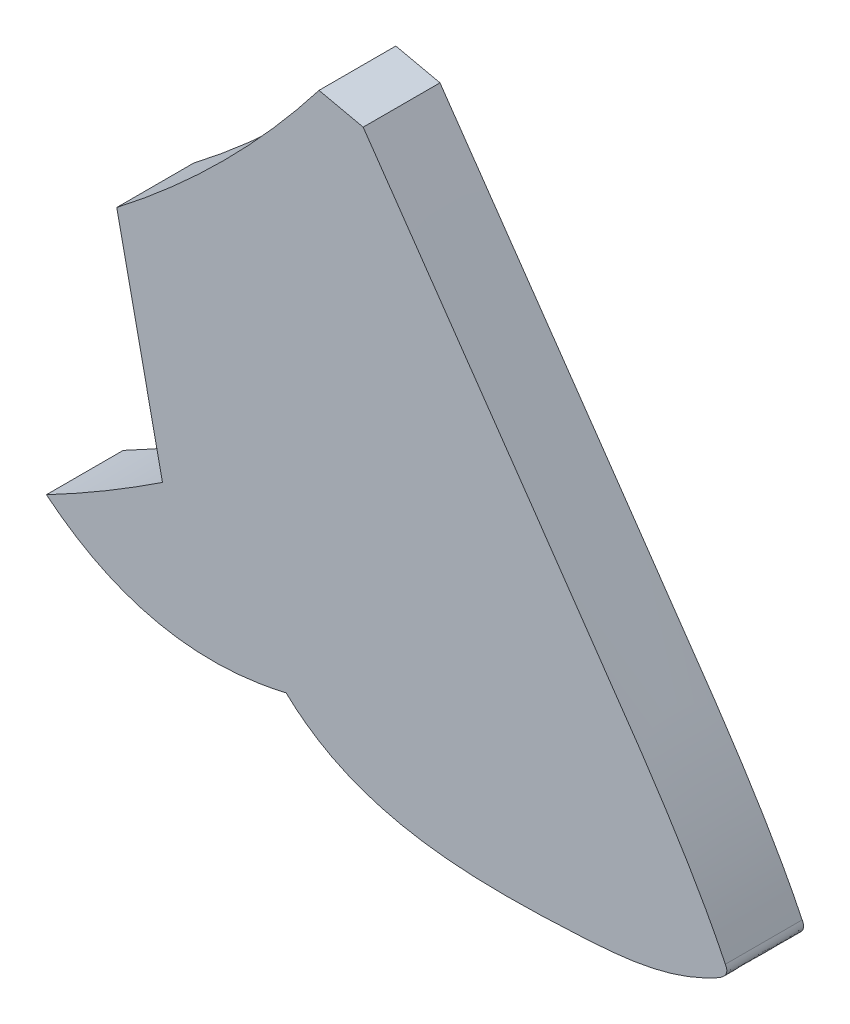
ISO-10303-21;
HEADER;
FILE_DESCRIPTION(('STEP AP214'),'2;1');
FILE_NAME('part.step','',(''),(''),'','','');
FILE_SCHEMA(('AUTOMOTIVE_DESIGN { 1 0 10303 214 1 1 1 1 }'));
ENDSEC;
DATA;
#1=APPLICATION_CONTEXT('core data for automotive mechanical design processes');
#2=APPLICATION_PROTOCOL_DEFINITION('international standard','automotive_design',2000,#1);
#3=PRODUCT_CONTEXT('',#1,'mechanical');
#4=PRODUCT('Part','Part','',(#3));
#5=PRODUCT_RELATED_PRODUCT_CATEGORY('part','',(#4));
#6=PRODUCT_DEFINITION_FORMATION('','',#4);
#7=PRODUCT_DEFINITION_CONTEXT('part definition',#1,'design');
#8=PRODUCT_DEFINITION('design','',#6,#7);
#9=PRODUCT_DEFINITION_SHAPE('','',#8);
#10=(LENGTH_UNIT() NAMED_UNIT(*) SI_UNIT(.MILLI.,.METRE.));
#11=(NAMED_UNIT(*) PLANE_ANGLE_UNIT() SI_UNIT($,.RADIAN.));
#12=(NAMED_UNIT(*) SI_UNIT($,.STERADIAN.) SOLID_ANGLE_UNIT());
#13=UNCERTAINTY_MEASURE_WITH_UNIT(LENGTH_MEASURE(1.E-05),#10,'distance_accuracy_value','');
#14=(GEOMETRIC_REPRESENTATION_CONTEXT(3) GLOBAL_UNCERTAINTY_ASSIGNED_CONTEXT((#13)) GLOBAL_UNIT_ASSIGNED_CONTEXT((#10,
#11,#12)) REPRESENTATION_CONTEXT('',''));
#15=CARTESIAN_POINT('',(0.,0.,0.));
#16=DIRECTION('',(0.,0.,1.));
#17=DIRECTION('',(1.,0.,0.));
#18=AXIS2_PLACEMENT_3D('',#15,#16,#17);
#19=CARTESIAN_POINT('',(0.,0.,0.));
#20=DIRECTION('',(0.,0.,1.));
#21=DIRECTION('',(1.,0.,0.));
#22=AXIS2_PLACEMENT_3D('',#19,#20,#21);
#23=PLANE('',#22);
#24=CARTESIAN_POINT('',(50.5136545200715,-48.3160755048055,0.));
#25=CARTESIAN_POINT('',(50.7011172379913,-48.6454402318248,0.));
#26=CARTESIAN_POINT('',(48.5240591666521,-49.9538392605319,0.));
#27=CARTESIAN_POINT('',(42.5275572551689,-50.418084569808,0.));
#28=CARTESIAN_POINT('',(36.182871361729,-50.418084569808,0.));
#29=CARTESIAN_POINT('',(33.3528454459016,-47.7136778830354,0.));
#30=B_SPLINE_CURVE_WITH_KNOTS('',3,(#24,#25,#26,#27,#28,#29),.UNSPECIFIED.,.F.,.F.,(4,1,1,4),
(0.,0.0484291937989246,0.338693976673703,1.),.UNSPECIFIED.);
#31=CARTESIAN_POINT('',(50.5136545200715,-48.3160755048055,0.));
#32=VERTEX_POINT('',#31);
#33=CARTESIAN_POINT('',(33.3528454459016,-47.7136778830354,0.));
#34=VERTEX_POINT('',#33);
#35=EDGE_CURVE('E119',#32,#34,#30,.T.);
#36=ORIENTED_EDGE('',*,*,#35,.T.);
#37=CARTESIAN_POINT('',(23.9856963450974,-45.6917300262926,0.));
#38=CARTESIAN_POINT('',(28.0044893849599,-48.9849538612235,0.));
#39=CARTESIAN_POINT('',(33.3528454459016,-47.7136778830354,0.));
#40=B_SPLINE_CURVE_WITH_KNOTS('',2,(#37,#38,#39),.UNSPECIFIED.,.F.,.F.,(3,3),(0.,1.),.UNSPECIFIED.);
#41=CARTESIAN_POINT('',(23.9856963450974,-45.6917300262927,0.));
#42=VERTEX_POINT('',#41);
#43=EDGE_CURVE('E59',#42,#34,#40,.T.);
#44=ORIENTED_EDGE('',*,*,#43,.F.);
#45=CARTESIAN_POINT('',(0.,0.,0.));
#46=DIRECTION('',(0.,0.,1.));
#47=DIRECTION('',(1.,0.,0.));
#48=AXIS2_PLACEMENT_3D('',#45,#46,#47);
#49=CIRCLE('',#48,51.6047267404337);
#50=CARTESIAN_POINT('',(28.5210177827812,-43.0069688142411,0.));
#51=VERTEX_POINT('',#50);
#52=EDGE_CURVE('E103',#42,#51,#49,.T.);
#53=ORIENTED_EDGE('',*,*,#52,.T.);
#54=DIRECTION('',(0.207813351299531,-0.97816849827709,0.));
#55=VECTOR('',#54,1.);
#56=CARTESIAN_POINT('',(18.5469930469791,3.94033623901268,0.));
#57=LINE('',#56,#55);
#58=CARTESIAN_POINT('',(26.7344605700676,-34.5977209246416,0.));
#59=VERTEX_POINT('',#58);
#60=EDGE_CURVE('E107',#59,#51,#57,.T.);
#61=ORIENTED_EDGE('',*,*,#60,.F.);
#62=CARTESIAN_POINT('',(0.,0.,0.));
#63=DIRECTION('',(0.,0.,1.));
#64=DIRECTION('',(1.,0.,0.));
#65=AXIS2_PLACEMENT_3D('',#62,#63,#64);
#66=CIRCLE('',#65,43.7233767583415);
#67=CARTESIAN_POINT('',(34.6378351515666,-26.6824671116592,0.));
#68=VERTEX_POINT('',#67);
#69=EDGE_CURVE('E237',#68,#59,#66,.F.);
#70=ORIENTED_EDGE('',*,*,#69,.F.);
#71=DIRECTION('',(0.976138518945381,-0.217148778101831,0.));
#72=VECTOR('',#71,1.);
#73=CARTESIAN_POINT('',(-4.0225118140589,-18.0822050160209,0.));
#74=LINE('',#73,#72);
#75=CARTESIAN_POINT('',(36.3625151690719,-27.0661341334488,0.));
#76=VERTEX_POINT('',#75);
#77=EDGE_CURVE('E118',#68,#76,#74,.T.);
#78=ORIENTED_EDGE('',*,*,#77,.T.);
#79=CARTESIAN_POINT('',(36.3625151690719,-27.0661341334488,0.));
#80=CARTESIAN_POINT('',(41.2537531502757,-34.1031059576251,0.));
#81=CARTESIAN_POINT('',(49.293684827641,-45.7691488499636,0.));
#82=CARTESIAN_POINT('',(50.5136545200715,-48.3160755048055,0.));
#83=B_SPLINE_CURVE_WITH_KNOTS('',2,(#79,#80,#81,#82),.UNSPECIFIED.,.F.,.F.,(3,1,3),(0.,
0.686639824154759,1.),.UNSPECIFIED.);
#84=EDGE_CURVE('E122',#76,#32,#83,.T.);
#85=ORIENTED_EDGE('',*,*,#84,.T.);
#86=EDGE_LOOP('',(#36,#44,#53,#61,#70,#78,#85));
#87=FACE_BOUND('',#86,.T.);
#88=ADVANCED_FACE('F39',(#87),#23,.F.);
#89=CARTESIAN_POINT('',(50.5136545200715,-48.3160755048055,10.));
#90=CARTESIAN_POINT('',(50.7011172379913,-48.6454402318248,10.));
#91=CARTESIAN_POINT('',(48.5240591666521,-49.9538392605319,10.));
#92=CARTESIAN_POINT('',(42.5275572551689,-50.418084569808,10.));
#93=CARTESIAN_POINT('',(36.182871361729,-50.418084569808,10.));
#94=CARTESIAN_POINT('',(33.3528454459016,-47.7136778830354,10.));
#95=B_SPLINE_CURVE_WITH_KNOTS('',3,(#89,#90,#91,#92,#93,#94),.UNSPECIFIED.,.F.,.F.,(4,1,1,4),
(0.,0.0484291937989246,0.338693976673703,1.),.UNSPECIFIED.);
#96=DIRECTION('',(0.,0.,-1.));
#97=VECTOR('',#96,1.);
#98=SURFACE_OF_LINEAR_EXTRUSION('',#95,#97);
#99=DIRECTION('',(0.,0.,-1.));
#100=VECTOR('',#99,1.);
#101=CARTESIAN_POINT('',(33.3528454459016,-47.7136778830354,10.));
#102=LINE('',#101,#100);
#103=CARTESIAN_POINT('',(33.3528454459016,-47.7136778830354,3.));
#104=VERTEX_POINT('',#103);
#105=EDGE_CURVE('E262',#104,#34,#102,.T.);
#106=ORIENTED_EDGE('',*,*,#105,.T.);
#107=ORIENTED_EDGE('',*,*,#35,.F.);
#108=DIRECTION('',(0.,0.,-1.));
#109=VECTOR('',#108,1.);
#110=CARTESIAN_POINT('',(50.5136545200715,-48.3160755048055,10.));
#111=LINE('',#110,#109);
#112=CARTESIAN_POINT('',(50.5136545200715,-48.3160755048055,3.));
#113=VERTEX_POINT('',#112);
#114=EDGE_CURVE('E260',#113,#32,#111,.T.);
#115=ORIENTED_EDGE('',*,*,#114,.F.);
#116=CARTESIAN_POINT('',(50.5136545200715,-48.3160755048055,3.));
#117=CARTESIAN_POINT('',(50.7011172379913,-48.6454402318248,3.));
#118=CARTESIAN_POINT('',(48.5240591666521,-49.9538392605319,3.));
#119=CARTESIAN_POINT('',(42.5275572551689,-50.418084569808,3.));
#120=CARTESIAN_POINT('',(36.182871361729,-50.418084569808,3.));
#121=CARTESIAN_POINT('',(33.3528454459016,-47.7136778830354,3.));
#122=B_SPLINE_CURVE_WITH_KNOTS('',3,(#116,#117,#118,#119,#120,#121),.UNSPECIFIED.,.F.,.F.,(4,1,
1,4),(0.,0.0484291937989246,0.338693976673703,1.),.UNSPECIFIED.);
#123=EDGE_CURVE('E130',#104,#113,#122,.F.);
#124=ORIENTED_EDGE('',*,*,#123,.F.);
#125=EDGE_LOOP('',(#106,#107,#115,#124));
#126=FACE_BOUND('',#125,.T.);
#127=ADVANCED_FACE('F145',(#126),#98,.T.);
#128=CARTESIAN_POINT('',(36.3625151690719,-27.0661341334488,10.));
#129=CARTESIAN_POINT('',(41.2537531502757,-34.1031059576251,10.));
#130=CARTESIAN_POINT('',(49.293684827641,-45.7691488499636,10.));
#131=CARTESIAN_POINT('',(50.5136545200715,-48.3160755048055,10.));
#132=B_SPLINE_CURVE_WITH_KNOTS('',2,(#128,#129,#130,#131),.UNSPECIFIED.,.F.,.F.,(3,1,3),(0.,
0.686639824154759,1.),.UNSPECIFIED.);
#133=DIRECTION('',(0.,0.,-1.));
#134=VECTOR('',#133,1.);
#135=SURFACE_OF_LINEAR_EXTRUSION('',#132,#134);
#136=ORIENTED_EDGE('',*,*,#114,.T.);
#137=ORIENTED_EDGE('',*,*,#84,.F.);
#138=DIRECTION('',(0.,0.,-1.));
#139=VECTOR('',#138,1.);
#140=CARTESIAN_POINT('',(36.3625151690719,-27.0661341334488,10.));
#141=LINE('',#140,#139);
#142=CARTESIAN_POINT('',(36.3625151690719,-27.0661341334488,3.));
#143=VERTEX_POINT('',#142);
#144=EDGE_CURVE('E241',#143,#76,#141,.T.);
#145=ORIENTED_EDGE('',*,*,#144,.F.);
#146=CARTESIAN_POINT('',(36.3625151690719,-27.0661341334488,3.));
#147=CARTESIAN_POINT('',(41.2537531502757,-34.1031059576251,3.));
#148=CARTESIAN_POINT('',(49.293684827641,-45.7691488499636,3.));
#149=CARTESIAN_POINT('',(50.5136545200715,-48.3160755048055,3.));
#150=B_SPLINE_CURVE_WITH_KNOTS('',2,(#146,#147,#148,#149),.UNSPECIFIED.,.F.,.F.,(3,1,3),(0.,
0.686639824154759,1.),.UNSPECIFIED.);
#151=EDGE_CURVE('E244',#113,#143,#150,.F.);
#152=ORIENTED_EDGE('',*,*,#151,.F.);
#153=EDGE_LOOP('',(#136,#137,#145,#152));
#154=FACE_BOUND('',#153,.T.);
#155=ADVANCED_FACE('F148',(#154),#135,.T.);
#156=CARTESIAN_POINT('',(-4.0225118140589,-18.0822050160209,10.));
#157=DIRECTION('',(0.217148778101831,0.976138518945381,0.));
#158=DIRECTION('',(-0.976138518945381,0.217148778101831,0.));
#159=AXIS2_PLACEMENT_3D('',#156,#157,#158);
#160=PLANE('',#159);
#161=ORIENTED_EDGE('',*,*,#144,.T.);
#162=ORIENTED_EDGE('',*,*,#77,.F.);
#163=DIRECTION('',(0.,0.,-1.));
#164=VECTOR('',#163,1.);
#165=CARTESIAN_POINT('',(34.6378351515666,-26.6824671116592,10.));
#166=LINE('',#165,#164);
#167=CARTESIAN_POINT('',(34.6378351515666,-26.6824671116592,3.));
#168=VERTEX_POINT('',#167);
#169=EDGE_CURVE('E240',#168,#68,#166,.T.);
#170=ORIENTED_EDGE('',*,*,#169,.F.);
#171=DIRECTION('',(-0.976138518945381,0.217148778101831,0.));
#172=VECTOR('',#171,1.);
#173=CARTESIAN_POINT('',(-4.0225118140589,-18.0822050160209,3.));
#174=LINE('',#173,#172);
#175=EDGE_CURVE('E51',#143,#168,#174,.T.);
#176=ORIENTED_EDGE('',*,*,#175,.F.);
#177=EDGE_LOOP('',(#161,#162,#170,#176));
#178=FACE_BOUND('',#177,.T.);
#179=ADVANCED_FACE('F167',(#178),#160,.T.);
#180=CARTESIAN_POINT('',(0.,0.,10.));
#181=DIRECTION('',(0.,0.,-1.));
#182=DIRECTION('',(-1.,0.,0.));
#183=AXIS2_PLACEMENT_3D('',#180,#181,#182);
#184=CYLINDRICAL_SURFACE('',#183,43.7233767583415);
#185=CARTESIAN_POINT('',(0.,0.,3.));
#186=DIRECTION('',(0.,0.,1.));
#187=DIRECTION('',(1.,0.,0.));
#188=AXIS2_PLACEMENT_3D('',#185,#186,#187);
#189=CIRCLE('',#188,43.7233767583415);
#190=CARTESIAN_POINT('',(26.7344605700676,-34.5977209246416,3.));
#191=VERTEX_POINT('',#190);
#192=EDGE_CURVE('E238',#191,#168,#189,.T.);
#193=ORIENTED_EDGE('',*,*,#192,.T.);
#194=ORIENTED_EDGE('',*,*,#169,.T.);
#195=ORIENTED_EDGE('',*,*,#69,.T.);
#196=DIRECTION('',(0.,0.,-1.));
#197=VECTOR('',#196,1.);
#198=CARTESIAN_POINT('',(26.7344605700676,-34.5977209246416,10.));
#199=LINE('',#198,#197);
#200=EDGE_CURVE('E112',#191,#59,#199,.T.);
#201=ORIENTED_EDGE('',*,*,#200,.F.);
#202=EDGE_LOOP('',(#193,#194,#195,#201));
#203=FACE_BOUND('',#202,.T.);
#204=ADVANCED_FACE('F175',(#203),#184,.F.);
#205=CARTESIAN_POINT('',(18.5469930469791,3.94033623901268,10.));
#206=DIRECTION('',(0.97816849827709,0.207813351299531,0.));
#207=DIRECTION('',(-0.207813351299531,0.97816849827709,0.));
#208=AXIS2_PLACEMENT_3D('',#205,#206,#207);
#209=PLANE('',#208);
#210=DIRECTION('',(-0.207813351299531,0.97816849827709,0.));
#211=VECTOR('',#210,1.);
#212=CARTESIAN_POINT('',(18.5469930469791,3.94033623901268,3.));
#213=LINE('',#212,#211);
#214=CARTESIAN_POINT('',(28.5210177827812,-43.0069688142411,3.));
#215=VERTEX_POINT('',#214);
#216=EDGE_CURVE('E235',#215,#191,#213,.T.);
#217=ORIENTED_EDGE('',*,*,#216,.T.);
#218=ORIENTED_EDGE('',*,*,#200,.T.);
#219=ORIENTED_EDGE('',*,*,#60,.T.);
#220=DIRECTION('',(0.,0.,-1.));
#221=VECTOR('',#220,1.);
#222=CARTESIAN_POINT('',(28.5210177827812,-43.0069688142411,10.));
#223=LINE('',#222,#221);
#224=EDGE_CURVE('E98',#215,#51,#223,.T.);
#225=ORIENTED_EDGE('',*,*,#224,.F.);
#226=EDGE_LOOP('',(#217,#218,#219,#225));
#227=FACE_BOUND('',#226,.T.);
#228=ADVANCED_FACE('F110',(#227),#209,.F.);
#229=CARTESIAN_POINT('',(0.,0.,10.));
#230=DIRECTION('',(0.,0.,-1.));
#231=DIRECTION('',(-1.,0.,0.));
#232=AXIS2_PLACEMENT_3D('',#229,#230,#231);
#233=CYLINDRICAL_SURFACE('',#232,51.6047267404337);
#234=ORIENTED_EDGE('',*,*,#224,.T.);
#235=ORIENTED_EDGE('',*,*,#52,.F.);
#236=DIRECTION('',(0.,0.,-1.));
#237=VECTOR('',#236,1.);
#238=CARTESIAN_POINT('',(23.9856963450974,-45.6917300262927,10.));
#239=LINE('',#238,#237);
#240=CARTESIAN_POINT('',(23.9856963450974,-45.6917300262927,3.));
#241=VERTEX_POINT('',#240);
#242=EDGE_CURVE('E131',#241,#42,#239,.T.);
#243=ORIENTED_EDGE('',*,*,#242,.F.);
#244=CARTESIAN_POINT('',(0.,0.,3.));
#245=DIRECTION('',(0.,0.,1.));
#246=DIRECTION('',(1.,0.,0.));
#247=AXIS2_PLACEMENT_3D('',#244,#245,#246);
#248=CIRCLE('',#247,51.6047267404337);
#249=EDGE_CURVE('E11',#215,#241,#248,.F.);
#250=ORIENTED_EDGE('',*,*,#249,.F.);
#251=EDGE_LOOP('',(#234,#235,#243,#250));
#252=FACE_BOUND('',#251,.T.);
#253=ADVANCED_FACE('F100',(#252),#233,.F.);
#254=CARTESIAN_POINT('',(23.9856963450974,-45.6917300262926,10.));
#255=CARTESIAN_POINT('',(28.0044893849599,-48.9849538612235,10.));
#256=CARTESIAN_POINT('',(33.3528454459016,-47.7136778830354,10.));
#257=B_SPLINE_CURVE_WITH_KNOTS('',2,(#254,#255,#256),.UNSPECIFIED.,.F.,.F.,(3,3),(0.,1.),.UNSPECIFIED.);
#258=DIRECTION('',(0.,0.,-1.));
#259=VECTOR('',#258,1.);
#260=SURFACE_OF_LINEAR_EXTRUSION('',#257,#259);
#261=CARTESIAN_POINT('',(23.9856963450974,-45.6917300262926,3.));
#262=CARTESIAN_POINT('',(28.0044893849599,-48.9849538612235,3.));
#263=CARTESIAN_POINT('',(33.3528454459016,-47.7136778830354,3.));
#264=B_SPLINE_CURVE_WITH_KNOTS('',2,(#261,#262,#263),.UNSPECIFIED.,.F.,.F.,(3,3),(0.,1.),.UNSPECIFIED.);
#265=EDGE_CURVE('E106',#104,#241,#264,.F.);
#266=ORIENTED_EDGE('',*,*,#265,.T.);
#267=ORIENTED_EDGE('',*,*,#242,.T.);
#268=ORIENTED_EDGE('',*,*,#43,.T.);
#269=ORIENTED_EDGE('',*,*,#105,.F.);
#270=EDGE_LOOP('',(#266,#267,#268,#269));
#271=FACE_BOUND('',#270,.T.);
#272=ADVANCED_FACE('F198',(#271),#260,.F.);
#273=CARTESIAN_POINT('',(0.,0.,3.));
#274=DIRECTION('',(0.,0.,1.));
#275=DIRECTION('',(1.,0.,0.));
#276=AXIS2_PLACEMENT_3D('',#273,#274,#275);
#277=PLANE('',#276);
#278=ORIENTED_EDGE('',*,*,#265,.F.);
#279=ORIENTED_EDGE('',*,*,#123,.T.);
#280=ORIENTED_EDGE('',*,*,#151,.T.);
#281=ORIENTED_EDGE('',*,*,#175,.T.);
#282=ORIENTED_EDGE('',*,*,#192,.F.);
#283=ORIENTED_EDGE('',*,*,#216,.F.);
#284=ORIENTED_EDGE('',*,*,#249,.T.);
#285=EDGE_LOOP('',(#278,#279,#280,#281,#282,#283,#284));
#286=FACE_BOUND('',#285,.T.);
#287=ADVANCED_FACE('F41',(#286),#277,.T.);
#288=CLOSED_SHELL('',(#88,#127,#155,#179,#204,#228,#253,#272,#287));
#289=MANIFOLD_SOLID_BREP('B2',#288);
#290=ADVANCED_BREP_SHAPE_REPRESENTATION('',(#18,#289),#14);
#291=SHAPE_DEFINITION_REPRESENTATION(#9,#290);
ENDSEC;
END-ISO-10303-21;
